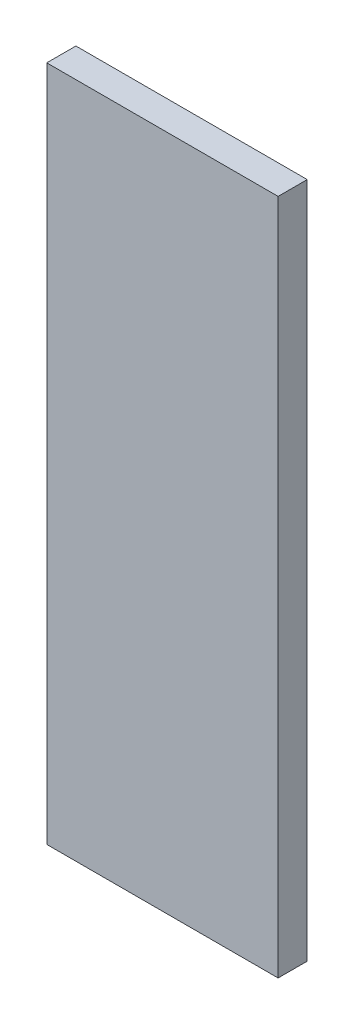
ISO-10303-21;
HEADER;
FILE_DESCRIPTION(('STEP AP214'),'2;1');
FILE_NAME('part.step','',(''),(''),'','','');
FILE_SCHEMA(('AUTOMOTIVE_DESIGN { 1 0 10303 214 1 1 1 1 }'));
ENDSEC;
DATA;
#1=APPLICATION_CONTEXT('core data for automotive mechanical design processes');
#2=APPLICATION_PROTOCOL_DEFINITION('international standard','automotive_design',2000,#1);
#3=PRODUCT_CONTEXT('',#1,'mechanical');
#4=PRODUCT('Part','Part','',(#3));
#5=PRODUCT_RELATED_PRODUCT_CATEGORY('part','',(#4));
#6=PRODUCT_DEFINITION_FORMATION('','',#4);
#7=PRODUCT_DEFINITION_CONTEXT('part definition',#1,'design');
#8=PRODUCT_DEFINITION('design','',#6,#7);
#9=PRODUCT_DEFINITION_SHAPE('','',#8);
#10=(LENGTH_UNIT() NAMED_UNIT(*) SI_UNIT(.MILLI.,.METRE.));
#11=(NAMED_UNIT(*) PLANE_ANGLE_UNIT() SI_UNIT($,.RADIAN.));
#12=(NAMED_UNIT(*) SI_UNIT($,.STERADIAN.) SOLID_ANGLE_UNIT());
#13=UNCERTAINTY_MEASURE_WITH_UNIT(LENGTH_MEASURE(1.E-05),#10,'distance_accuracy_value','');
#14=(GEOMETRIC_REPRESENTATION_CONTEXT(3) GLOBAL_UNCERTAINTY_ASSIGNED_CONTEXT((#13)) GLOBAL_UNIT_ASSIGNED_CONTEXT((#10,
#11,#12)) REPRESENTATION_CONTEXT('',''));
#15=CARTESIAN_POINT('',(0.,0.,0.));
#16=DIRECTION('',(0.,0.,1.));
#17=DIRECTION('',(1.,0.,0.));
#18=AXIS2_PLACEMENT_3D('',#15,#16,#17);
#19=CARTESIAN_POINT('',(0.67499992,-1.97498716,0.));
#20=DIRECTION('',(-1.,0.,0.));
#21=DIRECTION('',(0.,1.,0.));
#22=AXIS2_PLACEMENT_3D('',#19,#20,#21);
#23=PLANE('',#22);
#24=DIRECTION('',(0.,1.,0.));
#25=VECTOR('',#24,1.);
#26=CARTESIAN_POINT('',(0.67499992,-1.97498716,0.));
#27=LINE('',#26,#25);
#28=CARTESIAN_POINT('',(0.67499992,-1.97498716,0.));
#29=VERTEX_POINT('',#28);
#30=CARTESIAN_POINT('',(0.67499992,1.97498716,0.));
#31=VERTEX_POINT('',#30);
#32=EDGE_CURVE('E11',#29,#31,#27,.T.);
#33=ORIENTED_EDGE('',*,*,#32,.T.);
#34=DIRECTION('',(0.,0.,1.));
#35=VECTOR('',#34,1.);
#36=CARTESIAN_POINT('',(0.67499992,1.97498716,0.));
#37=LINE('',#36,#35);
#38=CARTESIAN_POINT('',(0.67499992,1.97498716,0.16999966));
#39=VERTEX_POINT('',#38);
#40=EDGE_CURVE('E24',#31,#39,#37,.T.);
#41=ORIENTED_EDGE('',*,*,#40,.T.);
#42=DIRECTION('',(0.,1.,0.));
#43=VECTOR('',#42,1.);
#44=CARTESIAN_POINT('',(0.67499992,-1.97498716,0.16999966));
#45=LINE('',#44,#43);
#46=CARTESIAN_POINT('',(0.67499992,-1.97498716,0.16999966));
#47=VERTEX_POINT('',#46);
#48=EDGE_CURVE('E87',#47,#39,#45,.T.);
#49=ORIENTED_EDGE('',*,*,#48,.F.);
#50=DIRECTION('',(0.,0.,1.));
#51=VECTOR('',#50,1.);
#52=CARTESIAN_POINT('',(0.67499992,-1.97498716,0.));
#53=LINE('',#52,#51);
#54=EDGE_CURVE('E36',#29,#47,#53,.T.);
#55=ORIENTED_EDGE('',*,*,#54,.F.);
#56=EDGE_LOOP('',(#33,#41,#49,#55));
#57=FACE_BOUND('',#56,.T.);
#58=ADVANCED_FACE('F17',(#57),#23,.F.);
#59=CARTESIAN_POINT('',(0.67499992,1.97498716,0.));
#60=DIRECTION('',(0.,-1.,0.));
#61=DIRECTION('',(-1.,0.,0.));
#62=AXIS2_PLACEMENT_3D('',#59,#60,#61);
#63=PLANE('',#62);
#64=DIRECTION('',(-1.,0.,0.));
#65=VECTOR('',#64,1.);
#66=CARTESIAN_POINT('',(0.67499992,1.97498716,0.));
#67=LINE('',#66,#65);
#68=CARTESIAN_POINT('',(-0.67499992,1.97498716,0.));
#69=VERTEX_POINT('',#68);
#70=EDGE_CURVE('E84',#31,#69,#67,.T.);
#71=ORIENTED_EDGE('',*,*,#70,.T.);
#72=DIRECTION('',(0.,0.,1.));
#73=VECTOR('',#72,1.);
#74=CARTESIAN_POINT('',(-0.67499992,1.97498716,0.));
#75=LINE('',#74,#73);
#76=CARTESIAN_POINT('',(-0.67499992,1.97498716,0.16999966));
#77=VERTEX_POINT('',#76);
#78=EDGE_CURVE('E82',#69,#77,#75,.T.);
#79=ORIENTED_EDGE('',*,*,#78,.T.);
#80=DIRECTION('',(-1.,0.,0.));
#81=VECTOR('',#80,1.);
#82=CARTESIAN_POINT('',(0.67499992,1.97498716,0.16999966));
#83=LINE('',#82,#81);
#84=EDGE_CURVE('E62',#39,#77,#83,.T.);
#85=ORIENTED_EDGE('',*,*,#84,.F.);
#86=ORIENTED_EDGE('',*,*,#40,.F.);
#87=EDGE_LOOP('',(#71,#79,#85,#86));
#88=FACE_BOUND('',#87,.T.);
#89=ADVANCED_FACE('F89',(#88),#63,.F.);
#90=CARTESIAN_POINT('',(-0.67499992,1.97498716,0.));
#91=DIRECTION('',(1.,0.,0.));
#92=DIRECTION('',(0.,-1.,0.));
#93=AXIS2_PLACEMENT_3D('',#90,#91,#92);
#94=PLANE('',#93);
#95=DIRECTION('',(0.,-1.,0.));
#96=VECTOR('',#95,1.);
#97=CARTESIAN_POINT('',(-0.67499992,1.97498716,0.));
#98=LINE('',#97,#96);
#99=CARTESIAN_POINT('',(-0.67499992,-1.97498716,0.));
#100=VERTEX_POINT('',#99);
#101=EDGE_CURVE('E71',#69,#100,#98,.T.);
#102=ORIENTED_EDGE('',*,*,#101,.T.);
#103=DIRECTION('',(0.,0.,1.));
#104=VECTOR('',#103,1.);
#105=CARTESIAN_POINT('',(-0.67499992,-1.97498716,0.));
#106=LINE('',#105,#104);
#107=CARTESIAN_POINT('',(-0.67499992,-1.97498716,0.16999966));
#108=VERTEX_POINT('',#107);
#109=EDGE_CURVE('E65',#100,#108,#106,.T.);
#110=ORIENTED_EDGE('',*,*,#109,.T.);
#111=DIRECTION('',(0.,-1.,0.));
#112=VECTOR('',#111,1.);
#113=CARTESIAN_POINT('',(-0.67499992,1.97498716,0.16999966));
#114=LINE('',#113,#112);
#115=EDGE_CURVE('E57',#77,#108,#114,.T.);
#116=ORIENTED_EDGE('',*,*,#115,.F.);
#117=ORIENTED_EDGE('',*,*,#78,.F.);
#118=EDGE_LOOP('',(#102,#110,#116,#117));
#119=FACE_BOUND('',#118,.T.);
#120=ADVANCED_FACE('F69',(#119),#94,.F.);
#121=CARTESIAN_POINT('',(-0.67499992,-1.97498716,0.));
#122=DIRECTION('',(0.,1.,0.));
#123=DIRECTION('',(1.,0.,0.));
#124=AXIS2_PLACEMENT_3D('',#121,#122,#123);
#125=PLANE('',#124);
#126=DIRECTION('',(1.,0.,0.));
#127=VECTOR('',#126,1.);
#128=CARTESIAN_POINT('',(-0.67499992,-1.97498716,0.));
#129=LINE('',#128,#127);
#130=EDGE_CURVE('E66',#100,#29,#129,.T.);
#131=ORIENTED_EDGE('',*,*,#130,.T.);
#132=ORIENTED_EDGE('',*,*,#54,.T.);
#133=DIRECTION('',(1.,0.,0.));
#134=VECTOR('',#133,1.);
#135=CARTESIAN_POINT('',(-0.67499992,-1.97498716,0.16999966));
#136=LINE('',#135,#134);
#137=EDGE_CURVE('E61',#108,#47,#136,.T.);
#138=ORIENTED_EDGE('',*,*,#137,.F.);
#139=ORIENTED_EDGE('',*,*,#109,.F.);
#140=EDGE_LOOP('',(#131,#132,#138,#139));
#141=FACE_BOUND('',#140,.T.);
#142=ADVANCED_FACE('F76',(#141),#125,.F.);
#143=CARTESIAN_POINT('',(0.,0.,0.));
#144=DIRECTION('',(0.,0.,1.));
#145=DIRECTION('',(1.,0.,0.));
#146=AXIS2_PLACEMENT_3D('',#143,#144,#145);
#147=PLANE('',#146);
#148=ORIENTED_EDGE('',*,*,#130,.F.);
#149=ORIENTED_EDGE('',*,*,#101,.F.);
#150=ORIENTED_EDGE('',*,*,#70,.F.);
#151=ORIENTED_EDGE('',*,*,#32,.F.);
#152=EDGE_LOOP('',(#148,#149,#150,#151));
#153=FACE_BOUND('',#152,.T.);
#154=ADVANCED_FACE('F91',(#153),#147,.F.);
#155=CARTESIAN_POINT('',(0.,0.,0.16999966));
#156=DIRECTION('',(0.,0.,1.));
#157=DIRECTION('',(1.,0.,0.));
#158=AXIS2_PLACEMENT_3D('',#155,#156,#157);
#159=PLANE('',#158);
#160=ORIENTED_EDGE('',*,*,#48,.T.);
#161=ORIENTED_EDGE('',*,*,#84,.T.);
#162=ORIENTED_EDGE('',*,*,#115,.T.);
#163=ORIENTED_EDGE('',*,*,#137,.T.);
#164=EDGE_LOOP('',(#160,#161,#162,#163));
#165=FACE_BOUND('',#164,.T.);
#166=ADVANCED_FACE('F59',(#165),#159,.T.);
#167=CLOSED_SHELL('',(#58,#89,#120,#142,#154,#166));
#168=MANIFOLD_SOLID_BREP('B1',#167);
#169=ADVANCED_BREP_SHAPE_REPRESENTATION('',(#18,#168),#14);
#170=SHAPE_DEFINITION_REPRESENTATION(#9,#169);
ENDSEC;
END-ISO-10303-21;
